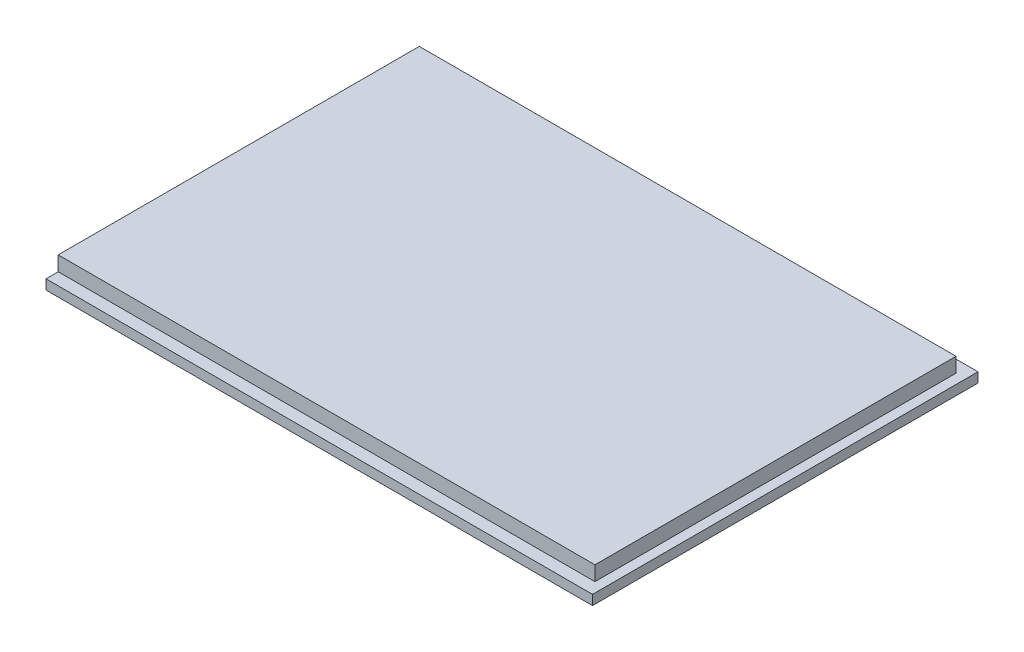
ISO-10303-21;
HEADER;
FILE_DESCRIPTION(('STEP AP214'),'2;1');
FILE_NAME('part.step','',(''),(''),'','','');
FILE_SCHEMA(('AUTOMOTIVE_DESIGN { 1 0 10303 214 1 1 1 1 }'));
ENDSEC;
DATA;
#1=APPLICATION_CONTEXT('core data for automotive mechanical design processes');
#2=APPLICATION_PROTOCOL_DEFINITION('international standard','automotive_design',2000,#1);
#3=PRODUCT_CONTEXT('',#1,'mechanical');
#4=PRODUCT('Part','Part','',(#3));
#5=PRODUCT_RELATED_PRODUCT_CATEGORY('part','',(#4));
#6=PRODUCT_DEFINITION_FORMATION('','',#4);
#7=PRODUCT_DEFINITION_CONTEXT('part definition',#1,'design');
#8=PRODUCT_DEFINITION('design','',#6,#7);
#9=PRODUCT_DEFINITION_SHAPE('','',#8);
#10=(LENGTH_UNIT() NAMED_UNIT(*) SI_UNIT(.MILLI.,.METRE.));
#11=(NAMED_UNIT(*) PLANE_ANGLE_UNIT() SI_UNIT($,.RADIAN.));
#12=(NAMED_UNIT(*) SI_UNIT($,.STERADIAN.) SOLID_ANGLE_UNIT());
#13=UNCERTAINTY_MEASURE_WITH_UNIT(LENGTH_MEASURE(1.E-05),#10,'distance_accuracy_value','');
#14=(GEOMETRIC_REPRESENTATION_CONTEXT(3) GLOBAL_UNCERTAINTY_ASSIGNED_CONTEXT((#13)) GLOBAL_UNIT_ASSIGNED_CONTEXT((#10,
#11,#12)) REPRESENTATION_CONTEXT('',''));
#15=CARTESIAN_POINT('',(0.,0.,0.));
#16=DIRECTION('',(0.,0.,1.));
#17=DIRECTION('',(1.,0.,0.));
#18=AXIS2_PLACEMENT_3D('',#15,#16,#17);
#19=CARTESIAN_POINT('',(22.4,0.8,-15.8));
#20=DIRECTION('',(-1.,0.,0.));
#21=DIRECTION('',(0.,0.,1.));
#22=AXIS2_PLACEMENT_3D('',#19,#20,#21);
#23=PLANE('',#22);
#24=DIRECTION('',(0.,0.,-1.));
#25=VECTOR('',#24,1.);
#26=CARTESIAN_POINT('',(22.4,0.,-15.8));
#27=LINE('',#26,#25);
#28=CARTESIAN_POINT('',(22.4,0.,15.8));
#29=VERTEX_POINT('',#28);
#30=CARTESIAN_POINT('',(22.4,0.,-15.8));
#31=VERTEX_POINT('',#30);
#32=EDGE_CURVE('E125',#29,#31,#27,.T.);
#33=ORIENTED_EDGE('',*,*,#32,.T.);
#34=DIRECTION('',(0.,-1.,0.));
#35=VECTOR('',#34,1.);
#36=CARTESIAN_POINT('',(22.4,0.8,-15.8));
#37=LINE('',#36,#35);
#38=CARTESIAN_POINT('',(22.4,0.8,-15.8));
#39=VERTEX_POINT('',#38);
#40=EDGE_CURVE('E11',#39,#31,#37,.T.);
#41=ORIENTED_EDGE('',*,*,#40,.F.);
#42=DIRECTION('',(0.,0.,-1.));
#43=VECTOR('',#42,1.);
#44=CARTESIAN_POINT('',(22.4,0.8,-15.8));
#45=LINE('',#44,#43);
#46=CARTESIAN_POINT('',(22.4,0.8,15.8));
#47=VERTEX_POINT('',#46);
#48=EDGE_CURVE('E134',#47,#39,#45,.T.);
#49=ORIENTED_EDGE('',*,*,#48,.F.);
#50=DIRECTION('',(0.,-1.,0.));
#51=VECTOR('',#50,1.);
#52=CARTESIAN_POINT('',(22.4,0.8,15.8));
#53=LINE('',#52,#51);
#54=EDGE_CURVE('E143',#47,#29,#53,.T.);
#55=ORIENTED_EDGE('',*,*,#54,.T.);
#56=EDGE_LOOP('',(#33,#41,#49,#55));
#57=FACE_BOUND('',#56,.T.);
#58=ADVANCED_FACE('F39',(#57),#23,.F.);
#59=CARTESIAN_POINT('',(-22.4,0.8,-15.8));
#60=DIRECTION('',(0.,0.,1.));
#61=DIRECTION('',(1.,0.,0.));
#62=AXIS2_PLACEMENT_3D('',#59,#60,#61);
#63=PLANE('',#62);
#64=DIRECTION('',(-1.,0.,0.));
#65=VECTOR('',#64,1.);
#66=CARTESIAN_POINT('',(-22.4,0.,-15.8));
#67=LINE('',#66,#65);
#68=CARTESIAN_POINT('',(-22.4,0.,-15.8));
#69=VERTEX_POINT('',#68);
#70=EDGE_CURVE('E128',#31,#69,#67,.T.);
#71=ORIENTED_EDGE('',*,*,#70,.T.);
#72=DIRECTION('',(0.,-1.,0.));
#73=VECTOR('',#72,1.);
#74=CARTESIAN_POINT('',(-22.4,0.8,-15.8));
#75=LINE('',#74,#73);
#76=CARTESIAN_POINT('',(-22.4,0.8,-15.8));
#77=VERTEX_POINT('',#76);
#78=EDGE_CURVE('E46',#77,#69,#75,.T.);
#79=ORIENTED_EDGE('',*,*,#78,.F.);
#80=DIRECTION('',(-1.,0.,0.));
#81=VECTOR('',#80,1.);
#82=CARTESIAN_POINT('',(-22.4,0.8,-15.8));
#83=LINE('',#82,#81);
#84=EDGE_CURVE('E137',#39,#77,#83,.T.);
#85=ORIENTED_EDGE('',*,*,#84,.F.);
#86=ORIENTED_EDGE('',*,*,#40,.T.);
#87=EDGE_LOOP('',(#71,#79,#85,#86));
#88=FACE_BOUND('',#87,.T.);
#89=ADVANCED_FACE('F170',(#88),#63,.F.);
#90=CARTESIAN_POINT('',(-22.4,0.8,-15.8));
#91=DIRECTION('',(1.,0.,0.));
#92=DIRECTION('',(0.,0.,-1.));
#93=AXIS2_PLACEMENT_3D('',#90,#91,#92);
#94=PLANE('',#93);
#95=DIRECTION('',(0.,0.,1.));
#96=VECTOR('',#95,1.);
#97=CARTESIAN_POINT('',(-22.4,0.,-15.8));
#98=LINE('',#97,#96);
#99=CARTESIAN_POINT('',(-22.4,0.,15.8));
#100=VERTEX_POINT('',#99);
#101=EDGE_CURVE('E146',#69,#100,#98,.T.);
#102=ORIENTED_EDGE('',*,*,#101,.T.);
#103=DIRECTION('',(0.,-1.,0.));
#104=VECTOR('',#103,1.);
#105=CARTESIAN_POINT('',(-22.4,0.8,15.8));
#106=LINE('',#105,#104);
#107=CARTESIAN_POINT('',(-22.4,0.8,15.8));
#108=VERTEX_POINT('',#107);
#109=EDGE_CURVE('E151',#108,#100,#106,.T.);
#110=ORIENTED_EDGE('',*,*,#109,.F.);
#111=DIRECTION('',(0.,0.,1.));
#112=VECTOR('',#111,1.);
#113=CARTESIAN_POINT('',(-22.4,0.8,-15.8));
#114=LINE('',#113,#112);
#115=CARTESIAN_POINT('',(-22.4,0.8,14.8));
#116=VERTEX_POINT('',#115);
#117=EDGE_CURVE('E124',#116,#108,#114,.T.);
#118=ORIENTED_EDGE('',*,*,#117,.F.);
#119=DIRECTION('',(0.,-1.,0.));
#120=VECTOR('',#119,1.);
#121=CARTESIAN_POINT('',(-22.4,2.,14.8));
#122=LINE('',#121,#120);
#123=CARTESIAN_POINT('',(-22.4,2.,14.8));
#124=VERTEX_POINT('',#123);
#125=EDGE_CURVE('E106',#124,#116,#122,.T.);
#126=ORIENTED_EDGE('',*,*,#125,.F.);
#127=DIRECTION('',(0.,0.,1.));
#128=VECTOR('',#127,1.);
#129=CARTESIAN_POINT('',(-22.4,2.,-14.8));
#130=LINE('',#129,#128);
#131=CARTESIAN_POINT('',(-22.4,2.,-14.8));
#132=VERTEX_POINT('',#131);
#133=EDGE_CURVE('E112',#132,#124,#130,.T.);
#134=ORIENTED_EDGE('',*,*,#133,.F.);
#135=DIRECTION('',(0.,-1.,0.));
#136=VECTOR('',#135,1.);
#137=CARTESIAN_POINT('',(-22.4,2.,-14.8));
#138=LINE('',#137,#136);
#139=CARTESIAN_POINT('',(-22.4,0.8,-14.8));
#140=VERTEX_POINT('',#139);
#141=EDGE_CURVE('E277',#132,#140,#138,.T.);
#142=ORIENTED_EDGE('',*,*,#141,.T.);
#143=EDGE_CURVE('E140',#77,#140,#114,.T.);
#144=ORIENTED_EDGE('',*,*,#143,.F.);
#145=ORIENTED_EDGE('',*,*,#78,.T.);
#146=EDGE_LOOP('',(#102,#110,#118,#126,#134,#142,#144,#145));
#147=FACE_BOUND('',#146,.T.);
#148=ADVANCED_FACE('F122',(#147),#94,.F.);
#149=CARTESIAN_POINT('',(-22.4,0.8,15.8));
#150=DIRECTION('',(0.,0.,-1.));
#151=DIRECTION('',(-1.,0.,0.));
#152=AXIS2_PLACEMENT_3D('',#149,#150,#151);
#153=PLANE('',#152);
#154=DIRECTION('',(1.,0.,0.));
#155=VECTOR('',#154,1.);
#156=CARTESIAN_POINT('',(-22.4,0.,15.8));
#157=LINE('',#156,#155);
#158=EDGE_CURVE('E138',#100,#29,#157,.T.);
#159=ORIENTED_EDGE('',*,*,#158,.T.);
#160=ORIENTED_EDGE('',*,*,#54,.F.);
#161=DIRECTION('',(1.,0.,0.));
#162=VECTOR('',#161,1.);
#163=CARTESIAN_POINT('',(-22.4,0.8,15.8));
#164=LINE('',#163,#162);
#165=EDGE_CURVE('E142',#108,#47,#164,.T.);
#166=ORIENTED_EDGE('',*,*,#165,.F.);
#167=ORIENTED_EDGE('',*,*,#109,.T.);
#168=EDGE_LOOP('',(#159,#160,#166,#167));
#169=FACE_BOUND('',#168,.T.);
#170=ADVANCED_FACE('F164',(#169),#153,.F.);
#171=CARTESIAN_POINT('',(0.,0.8,0.));
#172=DIRECTION('',(0.,1.,0.));
#173=DIRECTION('',(0.,0.,1.));
#174=AXIS2_PLACEMENT_3D('',#171,#172,#173);
#175=PLANE('',#174);
#176=DIRECTION('',(-1.,0.,0.));
#177=VECTOR('',#176,1.);
#178=CARTESIAN_POINT('',(-22.4,0.8,-14.8));
#179=LINE('',#178,#177);
#180=CARTESIAN_POINT('',(21.6,0.8,-14.8));
#181=VERTEX_POINT('',#180);
#182=EDGE_CURVE('E53',#181,#140,#179,.T.);
#183=ORIENTED_EDGE('',*,*,#182,.F.);
#184=DIRECTION('',(0.,0.,-1.));
#185=VECTOR('',#184,1.);
#186=CARTESIAN_POINT('',(21.6,0.8,-14.8));
#187=LINE('',#186,#185);
#188=CARTESIAN_POINT('',(21.6,0.8,14.8));
#189=VERTEX_POINT('',#188);
#190=EDGE_CURVE('E279',#189,#181,#187,.T.);
#191=ORIENTED_EDGE('',*,*,#190,.F.);
#192=DIRECTION('',(1.,0.,0.));
#193=VECTOR('',#192,1.);
#194=CARTESIAN_POINT('',(-22.4,0.8,14.8));
#195=LINE('',#194,#193);
#196=EDGE_CURVE('E59',#116,#189,#195,.T.);
#197=ORIENTED_EDGE('',*,*,#196,.F.);
#198=ORIENTED_EDGE('',*,*,#117,.T.);
#199=ORIENTED_EDGE('',*,*,#165,.T.);
#200=ORIENTED_EDGE('',*,*,#48,.T.);
#201=ORIENTED_EDGE('',*,*,#84,.T.);
#202=ORIENTED_EDGE('',*,*,#143,.T.);
#203=EDGE_LOOP('',(#183,#191,#197,#198,#199,#200,#201,#202));
#204=FACE_BOUND('',#203,.T.);
#205=ADVANCED_FACE('F169',(#204),#175,.T.);
#206=CARTESIAN_POINT('',(0.,0.,0.));
#207=DIRECTION('',(0.,1.,0.));
#208=DIRECTION('',(0.,0.,1.));
#209=AXIS2_PLACEMENT_3D('',#206,#207,#208);
#210=PLANE('',#209);
#211=ORIENTED_EDGE('',*,*,#32,.F.);
#212=ORIENTED_EDGE('',*,*,#158,.F.);
#213=ORIENTED_EDGE('',*,*,#101,.F.);
#214=ORIENTED_EDGE('',*,*,#70,.F.);
#215=EDGE_LOOP('',(#211,#212,#213,#214));
#216=FACE_BOUND('',#215,.T.);
#217=ADVANCED_FACE('F161',(#216),#210,.F.);
#218=CARTESIAN_POINT('',(-22.4,2.,14.8));
#219=DIRECTION('',(0.,0.,-1.));
#220=DIRECTION('',(-1.,0.,0.));
#221=AXIS2_PLACEMENT_3D('',#218,#219,#220);
#222=PLANE('',#221);
#223=ORIENTED_EDGE('',*,*,#196,.T.);
#224=DIRECTION('',(0.,-1.,0.));
#225=VECTOR('',#224,1.);
#226=CARTESIAN_POINT('',(21.6,2.,14.8));
#227=LINE('',#226,#225);
#228=CARTESIAN_POINT('',(21.6,2.,14.8));
#229=VERTEX_POINT('',#228);
#230=EDGE_CURVE('E108',#229,#189,#227,.T.);
#231=ORIENTED_EDGE('',*,*,#230,.F.);
#232=DIRECTION('',(1.,0.,0.));
#233=VECTOR('',#232,1.);
#234=CARTESIAN_POINT('',(-22.4,2.,14.8));
#235=LINE('',#234,#233);
#236=EDGE_CURVE('E102',#124,#229,#235,.T.);
#237=ORIENTED_EDGE('',*,*,#236,.F.);
#238=ORIENTED_EDGE('',*,*,#125,.T.);
#239=EDGE_LOOP('',(#223,#231,#237,#238));
#240=FACE_BOUND('',#239,.T.);
#241=ADVANCED_FACE('F104',(#240),#222,.F.);
#242=CARTESIAN_POINT('',(21.6,2.,-14.8));
#243=DIRECTION('',(-1.,0.,0.));
#244=DIRECTION('',(0.,0.,1.));
#245=AXIS2_PLACEMENT_3D('',#242,#243,#244);
#246=PLANE('',#245);
#247=ORIENTED_EDGE('',*,*,#190,.T.);
#248=DIRECTION('',(0.,-1.,0.));
#249=VECTOR('',#248,1.);
#250=CARTESIAN_POINT('',(21.6,2.,-14.8));
#251=LINE('',#250,#249);
#252=CARTESIAN_POINT('',(21.6,2.,-14.8));
#253=VERTEX_POINT('',#252);
#254=EDGE_CURVE('E130',#253,#181,#251,.T.);
#255=ORIENTED_EDGE('',*,*,#254,.F.);
#256=DIRECTION('',(0.,0.,-1.));
#257=VECTOR('',#256,1.);
#258=CARTESIAN_POINT('',(21.6,2.,-14.8));
#259=LINE('',#258,#257);
#260=EDGE_CURVE('E111',#229,#253,#259,.T.);
#261=ORIENTED_EDGE('',*,*,#260,.F.);
#262=ORIENTED_EDGE('',*,*,#230,.T.);
#263=EDGE_LOOP('',(#247,#255,#261,#262));
#264=FACE_BOUND('',#263,.T.);
#265=ADVANCED_FACE('F186',(#264),#246,.F.);
#266=CARTESIAN_POINT('',(-22.4,2.,-14.8));
#267=DIRECTION('',(0.,0.,1.));
#268=DIRECTION('',(1.,0.,0.));
#269=AXIS2_PLACEMENT_3D('',#266,#267,#268);
#270=PLANE('',#269);
#271=ORIENTED_EDGE('',*,*,#182,.T.);
#272=ORIENTED_EDGE('',*,*,#141,.F.);
#273=DIRECTION('',(-1.,0.,0.));
#274=VECTOR('',#273,1.);
#275=CARTESIAN_POINT('',(-22.4,2.,-14.8));
#276=LINE('',#275,#274);
#277=EDGE_CURVE('E117',#253,#132,#276,.T.);
#278=ORIENTED_EDGE('',*,*,#277,.F.);
#279=ORIENTED_EDGE('',*,*,#254,.T.);
#280=EDGE_LOOP('',(#271,#272,#278,#279));
#281=FACE_BOUND('',#280,.T.);
#282=ADVANCED_FACE('F189',(#281),#270,.F.);
#283=CARTESIAN_POINT('',(0.,2.,0.));
#284=DIRECTION('',(0.,1.,0.));
#285=DIRECTION('',(0.,0.,1.));
#286=AXIS2_PLACEMENT_3D('',#283,#284,#285);
#287=PLANE('',#286);
#288=ORIENTED_EDGE('',*,*,#133,.T.);
#289=ORIENTED_EDGE('',*,*,#236,.T.);
#290=ORIENTED_EDGE('',*,*,#260,.T.);
#291=ORIENTED_EDGE('',*,*,#277,.T.);
#292=EDGE_LOOP('',(#288,#289,#290,#291));
#293=FACE_BOUND('',#292,.T.);
#294=ADVANCED_FACE('F115',(#293),#287,.T.);
#295=CLOSED_SHELL('',(#58,#89,#148,#170,#205,#217,#241,#265,#282,#294));
#296=MANIFOLD_SOLID_BREP('B2',#295);
#297=ADVANCED_BREP_SHAPE_REPRESENTATION('',(#18,#296),#14);
#298=SHAPE_DEFINITION_REPRESENTATION(#9,#297);
ENDSEC;
END-ISO-10303-21;
